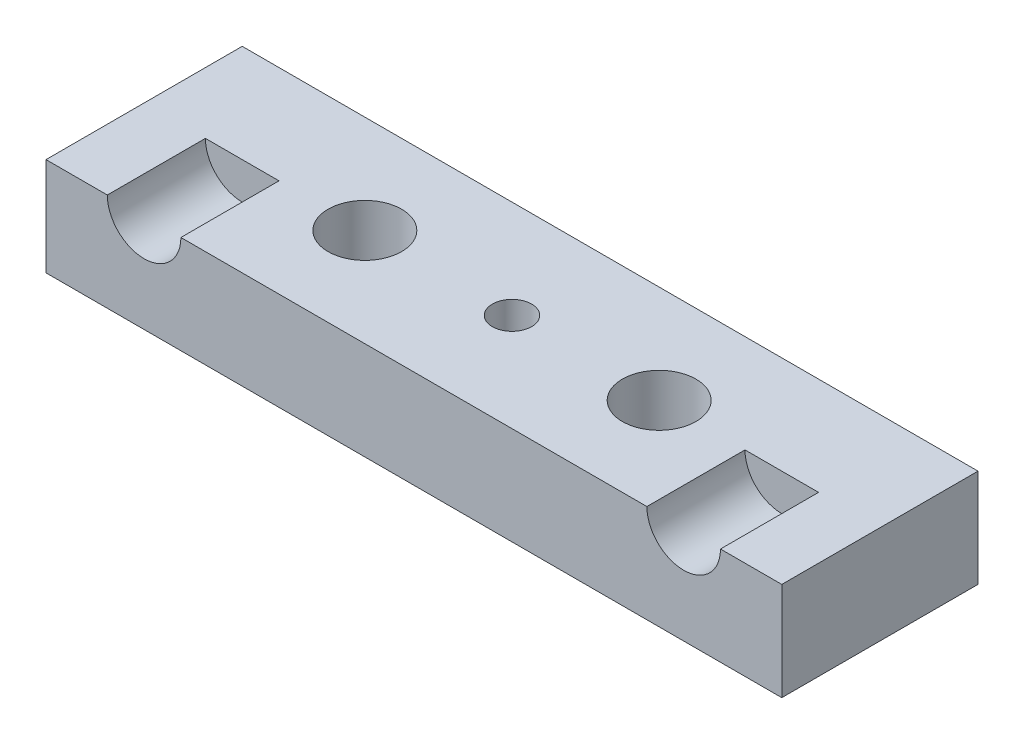
ISO-10303-21;
HEADER;
FILE_DESCRIPTION(('STEP AP214'),'2;1');
FILE_NAME('part.step','',(''),(''),'','','');
FILE_SCHEMA(('AUTOMOTIVE_DESIGN { 1 0 10303 214 1 1 1 1 }'));
ENDSEC;
DATA;
#1=APPLICATION_CONTEXT('core data for automotive mechanical design processes');
#2=APPLICATION_PROTOCOL_DEFINITION('international standard','automotive_design',2000,#1);
#3=PRODUCT_CONTEXT('',#1,'mechanical');
#4=PRODUCT('Part','Part','',(#3));
#5=PRODUCT_RELATED_PRODUCT_CATEGORY('part','',(#4));
#6=PRODUCT_DEFINITION_FORMATION('','',#4);
#7=PRODUCT_DEFINITION_CONTEXT('part definition',#1,'design');
#8=PRODUCT_DEFINITION('design','',#6,#7);
#9=PRODUCT_DEFINITION_SHAPE('','',#8);
#10=(LENGTH_UNIT() NAMED_UNIT(*) SI_UNIT(.MILLI.,.METRE.));
#11=(NAMED_UNIT(*) PLANE_ANGLE_UNIT() SI_UNIT($,.RADIAN.));
#12=(NAMED_UNIT(*) SI_UNIT($,.STERADIAN.) SOLID_ANGLE_UNIT());
#13=UNCERTAINTY_MEASURE_WITH_UNIT(LENGTH_MEASURE(1.E-05),#10,'distance_accuracy_value','');
#14=(GEOMETRIC_REPRESENTATION_CONTEXT(3) GLOBAL_UNCERTAINTY_ASSIGNED_CONTEXT((#13)) GLOBAL_UNIT_ASSIGNED_CONTEXT((#10,
#11,#12)) REPRESENTATION_CONTEXT('',''));
#15=CARTESIAN_POINT('',(0.,0.,0.));
#16=DIRECTION('',(0.,0.,1.));
#17=DIRECTION('',(1.,0.,0.));
#18=AXIS2_PLACEMENT_3D('',#15,#16,#17);
#19=CARTESIAN_POINT('',(-75.,20.,20.));
#20=DIRECTION('',(1.,0.,0.));
#21=DIRECTION('',(0.,0.,-1.));
#22=AXIS2_PLACEMENT_3D('',#19,#20,#21);
#23=PLANE('',#22);
#24=DIRECTION('',(0.,0.,1.));
#25=VECTOR('',#24,1.);
#26=CARTESIAN_POINT('',(-75.,0.,20.));
#27=LINE('',#26,#25);
#28=CARTESIAN_POINT('',(-75.,0.,-20.));
#29=VERTEX_POINT('',#28);
#30=CARTESIAN_POINT('',(-75.,0.,20.));
#31=VERTEX_POINT('',#30);
#32=EDGE_CURVE('E125',#29,#31,#27,.T.);
#33=ORIENTED_EDGE('',*,*,#32,.T.);
#34=DIRECTION('',(0.,-1.,0.));
#35=VECTOR('',#34,1.);
#36=CARTESIAN_POINT('',(-75.,20.,20.));
#37=LINE('',#36,#35);
#38=CARTESIAN_POINT('',(-75.,20.,20.));
#39=VERTEX_POINT('',#38);
#40=EDGE_CURVE('E143',#39,#31,#37,.T.);
#41=ORIENTED_EDGE('',*,*,#40,.F.);
#42=DIRECTION('',(0.,0.,1.));
#43=VECTOR('',#42,1.);
#44=CARTESIAN_POINT('',(-75.,20.,20.));
#45=LINE('',#44,#43);
#46=CARTESIAN_POINT('',(-75.,20.,-20.));
#47=VERTEX_POINT('',#46);
#48=EDGE_CURVE('E117',#47,#39,#45,.T.);
#49=ORIENTED_EDGE('',*,*,#48,.F.);
#50=DIRECTION('',(0.,-1.,0.));
#51=VECTOR('',#50,1.);
#52=CARTESIAN_POINT('',(-75.,20.,-20.));
#53=LINE('',#52,#51);
#54=EDGE_CURVE('E124',#47,#29,#53,.T.);
#55=ORIENTED_EDGE('',*,*,#54,.T.);
#56=EDGE_LOOP('',(#33,#41,#49,#55));
#57=FACE_BOUND('',#56,.T.);
#58=ADVANCED_FACE('F30',(#57),#23,.F.);
#59=CARTESIAN_POINT('',(75.,20.,20.));
#60=DIRECTION('',(0.,0.,-1.));
#61=DIRECTION('',(-1.,0.,0.));
#62=AXIS2_PLACEMENT_3D('',#59,#60,#61);
#63=PLANE('',#62);
#64=DIRECTION('',(1.,0.,0.));
#65=VECTOR('',#64,1.);
#66=CARTESIAN_POINT('',(75.,20.,20.));
#67=LINE('',#66,#65);
#68=CARTESIAN_POINT('',(62.5,20.,20.));
#69=VERTEX_POINT('',#68);
#70=CARTESIAN_POINT('',(75.,20.,20.));
#71=VERTEX_POINT('',#70);
#72=EDGE_CURVE('E106',#69,#71,#67,.T.);
#73=ORIENTED_EDGE('',*,*,#72,.F.);
#74=CARTESIAN_POINT('',(55.,20.,20.));
#75=DIRECTION('',(0.,0.,1.));
#76=DIRECTION('',(-1.,0.,0.));
#77=AXIS2_PLACEMENT_3D('',#74,#75,#76);
#78=CIRCLE('',#77,7.5);
#79=CARTESIAN_POINT('',(47.5,20.,20.));
#80=VERTEX_POINT('',#79);
#81=EDGE_CURVE('E94',#80,#69,#78,.T.);
#82=ORIENTED_EDGE('',*,*,#81,.F.);
#83=CARTESIAN_POINT('',(-47.5,20.,20.));
#84=VERTEX_POINT('',#83);
#85=EDGE_CURVE('E104',#84,#80,#67,.T.);
#86=ORIENTED_EDGE('',*,*,#85,.F.);
#87=CARTESIAN_POINT('',(-55.,20.,20.));
#88=DIRECTION('',(0.,0.,1.));
#89=DIRECTION('',(1.,0.,0.));
#90=AXIS2_PLACEMENT_3D('',#87,#88,#89);
#91=CIRCLE('',#90,7.5);
#92=CARTESIAN_POINT('',(-62.5,20.,20.));
#93=VERTEX_POINT('',#92);
#94=EDGE_CURVE('E175',#93,#84,#91,.T.);
#95=ORIENTED_EDGE('',*,*,#94,.F.);
#96=EDGE_CURVE('E113',#39,#93,#67,.T.);
#97=ORIENTED_EDGE('',*,*,#96,.F.);
#98=ORIENTED_EDGE('',*,*,#40,.T.);
#99=DIRECTION('',(1.,0.,0.));
#100=VECTOR('',#99,1.);
#101=CARTESIAN_POINT('',(75.,0.,20.));
#102=LINE('',#101,#100);
#103=CARTESIAN_POINT('',(75.,0.,20.));
#104=VERTEX_POINT('',#103);
#105=EDGE_CURVE('E128',#31,#104,#102,.T.);
#106=ORIENTED_EDGE('',*,*,#105,.T.);
#107=DIRECTION('',(0.,-1.,0.));
#108=VECTOR('',#107,1.);
#109=CARTESIAN_POINT('',(75.,20.,20.));
#110=LINE('',#109,#108);
#111=EDGE_CURVE('E140',#71,#104,#110,.T.);
#112=ORIENTED_EDGE('',*,*,#111,.F.);
#113=EDGE_LOOP('',(#73,#82,#86,#95,#97,#98,#106,#112));
#114=FACE_BOUND('',#113,.T.);
#115=ADVANCED_FACE('F102',(#114),#63,.F.);
#116=CARTESIAN_POINT('',(75.,20.,20.));
#117=DIRECTION('',(-1.,0.,0.));
#118=DIRECTION('',(0.,0.,1.));
#119=AXIS2_PLACEMENT_3D('',#116,#117,#118);
#120=PLANE('',#119);
#121=DIRECTION('',(0.,0.,-1.));
#122=VECTOR('',#121,1.);
#123=CARTESIAN_POINT('',(75.,0.,20.));
#124=LINE('',#123,#122);
#125=CARTESIAN_POINT('',(75.,0.,-20.));
#126=VERTEX_POINT('',#125);
#127=EDGE_CURVE('E131',#104,#126,#124,.T.);
#128=ORIENTED_EDGE('',*,*,#127,.T.);
#129=DIRECTION('',(0.,-1.,0.));
#130=VECTOR('',#129,1.);
#131=CARTESIAN_POINT('',(75.,20.,-20.));
#132=LINE('',#131,#130);
#133=CARTESIAN_POINT('',(75.,20.,-20.));
#134=VERTEX_POINT('',#133);
#135=EDGE_CURVE('E137',#134,#126,#132,.T.);
#136=ORIENTED_EDGE('',*,*,#135,.F.);
#137=DIRECTION('',(0.,0.,-1.));
#138=VECTOR('',#137,1.);
#139=CARTESIAN_POINT('',(75.,20.,20.));
#140=LINE('',#139,#138);
#141=EDGE_CURVE('E116',#71,#134,#140,.T.);
#142=ORIENTED_EDGE('',*,*,#141,.F.);
#143=ORIENTED_EDGE('',*,*,#111,.T.);
#144=EDGE_LOOP('',(#128,#136,#142,#143));
#145=FACE_BOUND('',#144,.T.);
#146=ADVANCED_FACE('F165',(#145),#120,.F.);
#147=CARTESIAN_POINT('',(75.,20.,-20.));
#148=DIRECTION('',(0.,0.,1.));
#149=DIRECTION('',(1.,0.,0.));
#150=AXIS2_PLACEMENT_3D('',#147,#148,#149);
#151=PLANE('',#150);
#152=DIRECTION('',(-1.,0.,0.));
#153=VECTOR('',#152,1.);
#154=CARTESIAN_POINT('',(75.,0.,-20.));
#155=LINE('',#154,#153);
#156=EDGE_CURVE('E133',#126,#29,#155,.T.);
#157=ORIENTED_EDGE('',*,*,#156,.T.);
#158=ORIENTED_EDGE('',*,*,#54,.F.);
#159=DIRECTION('',(-1.,0.,0.));
#160=VECTOR('',#159,1.);
#161=CARTESIAN_POINT('',(75.,20.,-20.));
#162=LINE('',#161,#160);
#163=EDGE_CURVE('E122',#134,#47,#162,.T.);
#164=ORIENTED_EDGE('',*,*,#163,.F.);
#165=ORIENTED_EDGE('',*,*,#135,.T.);
#166=EDGE_LOOP('',(#157,#158,#164,#165));
#167=FACE_BOUND('',#166,.T.);
#168=ADVANCED_FACE('F181',(#167),#151,.F.);
#169=CARTESIAN_POINT('',(-75.,20.,-20.));
#170=DIRECTION('',(0.,1.,0.));
#171=DIRECTION('',(0.,0.,1.));
#172=AXIS2_PLACEMENT_3D('',#169,#170,#171);
#173=PLANE('',#172);
#174=DIRECTION('',(0.,0.,1.));
#175=VECTOR('',#174,1.);
#176=CARTESIAN_POINT('',(47.5,20.,0.));
#177=LINE('',#176,#175);
#178=CARTESIAN_POINT('',(47.5,20.,0.));
#179=VERTEX_POINT('',#178);
#180=EDGE_CURVE('E11',#179,#80,#177,.T.);
#181=ORIENTED_EDGE('',*,*,#180,.F.);
#182=DIRECTION('',(-1.,0.,0.));
#183=VECTOR('',#182,1.);
#184=CARTESIAN_POINT('',(-75.,20.,0.));
#185=LINE('',#184,#183);
#186=CARTESIAN_POINT('',(62.5,20.,0.));
#187=VERTEX_POINT('',#186);
#188=EDGE_CURVE('E151',#187,#179,#185,.T.);
#189=ORIENTED_EDGE('',*,*,#188,.F.);
#190=DIRECTION('',(0.,0.,1.));
#191=VECTOR('',#190,1.);
#192=CARTESIAN_POINT('',(62.5,20.,0.));
#193=LINE('',#192,#191);
#194=EDGE_CURVE('E37',#69,#187,#193,.F.);
#195=ORIENTED_EDGE('',*,*,#194,.F.);
#196=ORIENTED_EDGE('',*,*,#72,.T.);
#197=ORIENTED_EDGE('',*,*,#141,.T.);
#198=ORIENTED_EDGE('',*,*,#163,.T.);
#199=ORIENTED_EDGE('',*,*,#48,.T.);
#200=ORIENTED_EDGE('',*,*,#96,.T.);
#201=DIRECTION('',(0.,0.,1.));
#202=VECTOR('',#201,1.);
#203=CARTESIAN_POINT('',(-62.5,20.,0.));
#204=LINE('',#203,#202);
#205=CARTESIAN_POINT('',(-62.5,20.,0.));
#206=VERTEX_POINT('',#205);
#207=EDGE_CURVE('E149',#206,#93,#204,.T.);
#208=ORIENTED_EDGE('',*,*,#207,.F.);
#209=DIRECTION('',(1.,0.,0.));
#210=VECTOR('',#209,1.);
#211=CARTESIAN_POINT('',(-75.,20.,0.));
#212=LINE('',#211,#210);
#213=CARTESIAN_POINT('',(-47.5,20.,0.));
#214=VERTEX_POINT('',#213);
#215=EDGE_CURVE('E146',#206,#214,#212,.T.);
#216=ORIENTED_EDGE('',*,*,#215,.T.);
#217=DIRECTION('',(0.,0.,1.));
#218=VECTOR('',#217,1.);
#219=CARTESIAN_POINT('',(-47.5,20.,0.));
#220=LINE('',#219,#218);
#221=EDGE_CURVE('E112',#84,#214,#220,.F.);
#222=ORIENTED_EDGE('',*,*,#221,.F.);
#223=ORIENTED_EDGE('',*,*,#85,.T.);
#224=EDGE_LOOP('',(#181,#189,#195,#196,#197,#198,#199,#200,#208,#216,#222,#223));
#225=FACE_BOUND('',#224,.T.);
#226=CARTESIAN_POINT('',(0.,20.,0.));
#227=DIRECTION('',(0.,1.,0.));
#228=DIRECTION('',(0.,0.,1.));
#229=AXIS2_PLACEMENT_3D('',#226,#227,#228);
#230=CIRCLE('',#229,4.);
#231=CARTESIAN_POINT('',(0.,20.,4.));
#232=VERTEX_POINT('',#231);
#233=EDGE_CURVE('E284',#232,#232,#230,.T.);
#234=ORIENTED_EDGE('',*,*,#233,.F.);
#235=EDGE_LOOP('',(#234));
#236=FACE_BOUND('',#235,.T.);
#237=CARTESIAN_POINT('',(30.,20.,0.));
#238=DIRECTION('',(0.,1.,0.));
#239=DIRECTION('',(0.,0.,-1.));
#240=AXIS2_PLACEMENT_3D('',#237,#238,#239);
#241=CIRCLE('',#240,7.5);
#242=CARTESIAN_POINT('',(30.,20.,-7.50000000000003));
#243=VERTEX_POINT('',#242);
#244=EDGE_CURVE('E293',#243,#243,#241,.T.);
#245=ORIENTED_EDGE('',*,*,#244,.F.);
#246=EDGE_LOOP('',(#245));
#247=FACE_BOUND('',#246,.T.);
#248=CARTESIAN_POINT('',(-30.,20.,0.));
#249=DIRECTION('',(0.,1.,0.));
#250=DIRECTION('',(0.,0.,1.));
#251=AXIS2_PLACEMENT_3D('',#248,#249,#250);
#252=CIRCLE('',#251,7.5);
#253=CARTESIAN_POINT('',(-30.,20.,7.5));
#254=VERTEX_POINT('',#253);
#255=EDGE_CURVE('E298',#254,#254,#252,.T.);
#256=ORIENTED_EDGE('',*,*,#255,.F.);
#257=EDGE_LOOP('',(#256));
#258=FACE_BOUND('',#257,.T.);
#259=ADVANCED_FACE('F109',(#225,#236,#247,#258),#173,.T.);
#260=CARTESIAN_POINT('',(-75.,0.,-20.));
#261=DIRECTION('',(0.,1.,0.));
#262=DIRECTION('',(0.,0.,1.));
#263=AXIS2_PLACEMENT_3D('',#260,#261,#262);
#264=PLANE('',#263);
#265=CARTESIAN_POINT('',(0.,0.,0.));
#266=DIRECTION('',(0.,1.,0.));
#267=DIRECTION('',(0.,0.,1.));
#268=AXIS2_PLACEMENT_3D('',#265,#266,#267);
#269=CIRCLE('',#268,4.);
#270=CARTESIAN_POINT('',(0.,0.,4.));
#271=VERTEX_POINT('',#270);
#272=EDGE_CURVE('E287',#271,#271,#269,.T.);
#273=ORIENTED_EDGE('',*,*,#272,.T.);
#274=EDGE_LOOP('',(#273));
#275=FACE_BOUND('',#274,.T.);
#276=CARTESIAN_POINT('',(30.,0.,0.));
#277=DIRECTION('',(0.,1.,0.));
#278=DIRECTION('',(0.,0.,-1.));
#279=AXIS2_PLACEMENT_3D('',#276,#277,#278);
#280=CIRCLE('',#279,7.5);
#281=CARTESIAN_POINT('',(30.,0.,-7.50000000000003));
#282=VERTEX_POINT('',#281);
#283=EDGE_CURVE('E295',#282,#282,#280,.T.);
#284=ORIENTED_EDGE('',*,*,#283,.T.);
#285=EDGE_LOOP('',(#284));
#286=FACE_BOUND('',#285,.T.);
#287=CARTESIAN_POINT('',(-30.,0.,0.));
#288=DIRECTION('',(0.,1.,0.));
#289=DIRECTION('',(0.,0.,1.));
#290=AXIS2_PLACEMENT_3D('',#287,#288,#289);
#291=CIRCLE('',#290,7.5);
#292=CARTESIAN_POINT('',(-30.,0.,7.5));
#293=VERTEX_POINT('',#292);
#294=EDGE_CURVE('E129',#293,#293,#291,.T.);
#295=ORIENTED_EDGE('',*,*,#294,.T.);
#296=EDGE_LOOP('',(#295));
#297=FACE_BOUND('',#296,.T.);
#298=ORIENTED_EDGE('',*,*,#32,.F.);
#299=ORIENTED_EDGE('',*,*,#156,.F.);
#300=ORIENTED_EDGE('',*,*,#127,.F.);
#301=ORIENTED_EDGE('',*,*,#105,.F.);
#302=EDGE_LOOP('',(#298,#299,#300,#301));
#303=FACE_BOUND('',#302,.T.);
#304=ADVANCED_FACE('F172',(#275,#286,#297,#303),#264,.F.);
#305=CARTESIAN_POINT('',(-30.,0.,0.));
#306=DIRECTION('',(0.,1.,0.));
#307=DIRECTION('',(0.,0.,1.));
#308=AXIS2_PLACEMENT_3D('',#305,#306,#307);
#309=CYLINDRICAL_SURFACE('',#308,7.5);
#310=ORIENTED_EDGE('',*,*,#294,.F.);
#311=EDGE_LOOP('',(#310));
#312=FACE_BOUND('',#311,.T.);
#313=ORIENTED_EDGE('',*,*,#255,.T.);
#314=EDGE_LOOP('',(#313));
#315=FACE_BOUND('',#314,.T.);
#316=ADVANCED_FACE('F192',(#312,#315),#309,.F.);
#317=CARTESIAN_POINT('',(30.,0.,0.));
#318=DIRECTION('',(0.,1.,0.));
#319=DIRECTION('',(0.,0.,1.));
#320=AXIS2_PLACEMENT_3D('',#317,#318,#319);
#321=CYLINDRICAL_SURFACE('',#320,7.5);
#322=ORIENTED_EDGE('',*,*,#283,.F.);
#323=EDGE_LOOP('',(#322));
#324=FACE_BOUND('',#323,.T.);
#325=ORIENTED_EDGE('',*,*,#244,.T.);
#326=EDGE_LOOP('',(#325));
#327=FACE_BOUND('',#326,.T.);
#328=ADVANCED_FACE('F198',(#324,#327),#321,.F.);
#329=CARTESIAN_POINT('',(0.,0.,0.));
#330=DIRECTION('',(0.,1.,0.));
#331=DIRECTION('',(0.,0.,1.));
#332=AXIS2_PLACEMENT_3D('',#329,#330,#331);
#333=CYLINDRICAL_SURFACE('',#332,4.);
#334=ORIENTED_EDGE('',*,*,#272,.F.);
#335=EDGE_LOOP('',(#334));
#336=FACE_BOUND('',#335,.T.);
#337=ORIENTED_EDGE('',*,*,#233,.T.);
#338=EDGE_LOOP('',(#337));
#339=FACE_BOUND('',#338,.T.);
#340=ADVANCED_FACE('F202',(#336,#339),#333,.F.);
#341=CARTESIAN_POINT('',(-55.,20.,0.));
#342=DIRECTION('',(0.,0.,1.));
#343=DIRECTION('',(1.,0.,0.));
#344=AXIS2_PLACEMENT_3D('',#341,#342,#343);
#345=CYLINDRICAL_SURFACE('',#344,7.5);
#346=ORIENTED_EDGE('',*,*,#207,.T.);
#347=ORIENTED_EDGE('',*,*,#94,.T.);
#348=ORIENTED_EDGE('',*,*,#221,.T.);
#349=CARTESIAN_POINT('',(-55.,20.,0.));
#350=DIRECTION('',(0.,0.,1.));
#351=DIRECTION('',(1.,0.,0.));
#352=AXIS2_PLACEMENT_3D('',#349,#350,#351);
#353=CIRCLE('',#352,7.5);
#354=EDGE_CURVE('E50',#206,#214,#353,.T.);
#355=ORIENTED_EDGE('',*,*,#354,.F.);
#356=EDGE_LOOP('',(#346,#347,#348,#355));
#357=FACE_BOUND('',#356,.T.);
#358=ADVANCED_FACE('F206',(#357),#345,.F.);
#359=CARTESIAN_POINT('',(-55.,20.,0.));
#360=DIRECTION('',(0.,0.,1.));
#361=DIRECTION('',(1.,0.,0.));
#362=AXIS2_PLACEMENT_3D('',#359,#360,#361);
#363=PLANE('',#362);
#364=ORIENTED_EDGE('',*,*,#354,.T.);
#365=ORIENTED_EDGE('',*,*,#215,.F.);
#366=EDGE_LOOP('',(#364,#365));
#367=FACE_BOUND('',#366,.T.);
#368=ADVANCED_FACE('F158',(#367),#363,.T.);
#369=CARTESIAN_POINT('',(55.,20.,0.));
#370=DIRECTION('',(0.,0.,1.));
#371=DIRECTION('',(1.,0.,0.));
#372=AXIS2_PLACEMENT_3D('',#369,#370,#371);
#373=CYLINDRICAL_SURFACE('',#372,7.5);
#374=ORIENTED_EDGE('',*,*,#180,.T.);
#375=ORIENTED_EDGE('',*,*,#81,.T.);
#376=ORIENTED_EDGE('',*,*,#194,.T.);
#377=CARTESIAN_POINT('',(55.,20.,0.));
#378=DIRECTION('',(0.,0.,1.));
#379=DIRECTION('',(-1.,0.,0.));
#380=AXIS2_PLACEMENT_3D('',#377,#378,#379);
#381=CIRCLE('',#380,7.5);
#382=EDGE_CURVE('E43',#179,#187,#381,.T.);
#383=ORIENTED_EDGE('',*,*,#382,.F.);
#384=EDGE_LOOP('',(#374,#375,#376,#383));
#385=FACE_BOUND('',#384,.T.);
#386=ADVANCED_FACE('F93',(#385),#373,.F.);
#387=CARTESIAN_POINT('',(55.,20.,0.));
#388=DIRECTION('',(0.,0.,-1.));
#389=DIRECTION('',(-1.,0.,0.));
#390=AXIS2_PLACEMENT_3D('',#387,#388,#389);
#391=PLANE('',#390);
#392=ORIENTED_EDGE('',*,*,#188,.T.);
#393=ORIENTED_EDGE('',*,*,#382,.T.);
#394=EDGE_LOOP('',(#392,#393));
#395=FACE_BOUND('',#394,.T.);
#396=ADVANCED_FACE('F152',(#395),#391,.F.);
#397=CLOSED_SHELL('',(#58,#115,#146,#168,#259,#304,#316,#328,#340,#358,#368,#386,#396));
#398=MANIFOLD_SOLID_BREP('B2',#397);
#399=ADVANCED_BREP_SHAPE_REPRESENTATION('',(#18,#398),#14);
#400=SHAPE_DEFINITION_REPRESENTATION(#9,#399);
ENDSEC;
END-ISO-10303-21;
